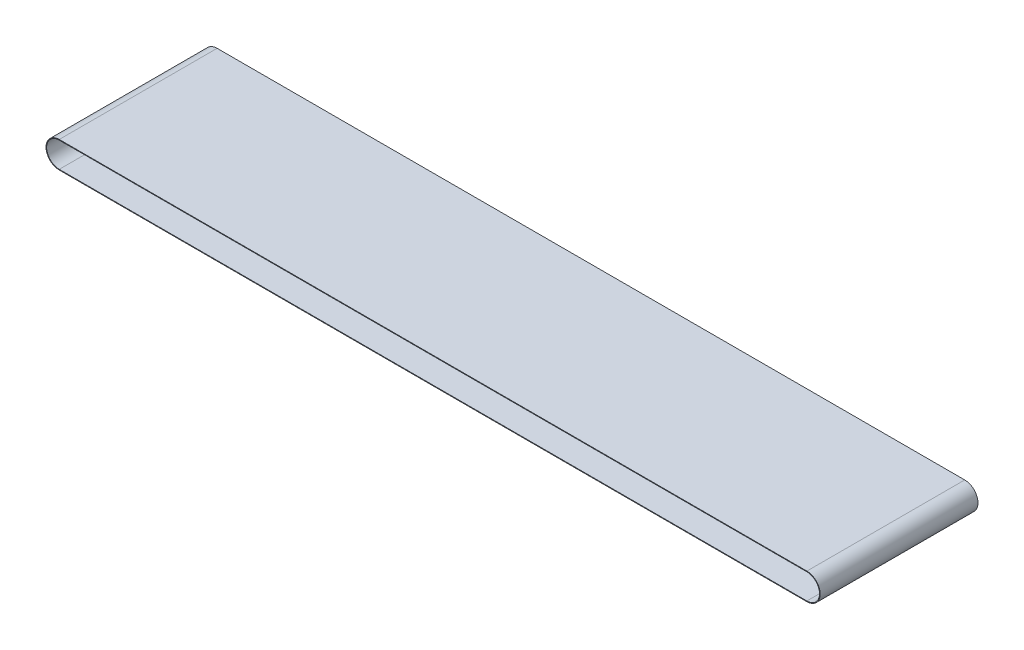
ISO-10303-21;
HEADER;
FILE_DESCRIPTION(('STEP AP214'),'2;1');
FILE_NAME('part.step','',(''),(''),'','','');
FILE_SCHEMA(('AUTOMOTIVE_DESIGN { 1 0 10303 214 1 1 1 1 }'));
ENDSEC;
DATA;
#1=APPLICATION_CONTEXT('core data for automotive mechanical design processes');
#2=APPLICATION_PROTOCOL_DEFINITION('international standard','automotive_design',2000,#1);
#3=PRODUCT_CONTEXT('',#1,'mechanical');
#4=PRODUCT('Part','Part','',(#3));
#5=PRODUCT_RELATED_PRODUCT_CATEGORY('part','',(#4));
#6=PRODUCT_DEFINITION_FORMATION('','',#4);
#7=PRODUCT_DEFINITION_CONTEXT('part definition',#1,'design');
#8=PRODUCT_DEFINITION('design','',#6,#7);
#9=PRODUCT_DEFINITION_SHAPE('','',#8);
#10=(LENGTH_UNIT() NAMED_UNIT(*) SI_UNIT(.MILLI.,.METRE.));
#11=(NAMED_UNIT(*) PLANE_ANGLE_UNIT() SI_UNIT($,.RADIAN.));
#12=(NAMED_UNIT(*) SI_UNIT($,.STERADIAN.) SOLID_ANGLE_UNIT());
#13=UNCERTAINTY_MEASURE_WITH_UNIT(LENGTH_MEASURE(1.E-05),#10,'distance_accuracy_value','');
#14=(GEOMETRIC_REPRESENTATION_CONTEXT(3) GLOBAL_UNCERTAINTY_ASSIGNED_CONTEXT((#13)) GLOBAL_UNIT_ASSIGNED_CONTEXT((#10,
#11,#12)) REPRESENTATION_CONTEXT('',''));
#15=CARTESIAN_POINT('',(0.,0.,0.));
#16=DIRECTION('',(0.,0.,1.));
#17=DIRECTION('',(1.,0.,0.));
#18=AXIS2_PLACEMENT_3D('',#15,#16,#17);
#19=CARTESIAN_POINT('',(-1184.025,0.,250.));
#20=DIRECTION('',(0.,0.,1.));
#21=DIRECTION('',(1.,0.,0.));
#22=AXIS2_PLACEMENT_3D('',#19,#20,#21);
#23=PLANE('',#22);
#24=CARTESIAN_POINT('',(-1184.025,0.,250.));
#25=DIRECTION('',(0.,0.,1.));
#26=DIRECTION('',(1.,0.,0.));
#27=AXIS2_PLACEMENT_3D('',#24,#25,#26);
#28=CIRCLE('',#27,42.);
#29=CARTESIAN_POINT('',(-1184.025,42.,250.));
#30=VERTEX_POINT('',#29);
#31=CARTESIAN_POINT('',(-1184.025,-42.,250.));
#32=VERTEX_POINT('',#31);
#33=EDGE_CURVE('E131',#30,#32,#28,.T.);
#34=ORIENTED_EDGE('',*,*,#33,.T.);
#35=DIRECTION('',(1.,0.,0.));
#36=VECTOR('',#35,1.);
#37=CARTESIAN_POINT('',(-1184.025,-42.,250.));
#38=LINE('',#37,#36);
#39=CARTESIAN_POINT('',(1184.025,-42.,250.));
#40=VERTEX_POINT('',#39);
#41=EDGE_CURVE('E134',#32,#40,#38,.T.);
#42=ORIENTED_EDGE('',*,*,#41,.T.);
#43=CARTESIAN_POINT('',(1184.025,0.,250.));
#44=DIRECTION('',(0.,0.,1.));
#45=DIRECTION('',(-1.,0.,0.));
#46=AXIS2_PLACEMENT_3D('',#43,#44,#45);
#47=CIRCLE('',#46,42.);
#48=CARTESIAN_POINT('',(1184.025,42.,250.));
#49=VERTEX_POINT('',#48);
#50=EDGE_CURVE('E137',#40,#49,#47,.T.);
#51=ORIENTED_EDGE('',*,*,#50,.T.);
#52=DIRECTION('',(-1.,0.,0.));
#53=VECTOR('',#52,1.);
#54=CARTESIAN_POINT('',(-1184.025,42.,250.));
#55=LINE('',#54,#53);
#56=EDGE_CURVE('E139',#49,#30,#55,.T.);
#57=ORIENTED_EDGE('',*,*,#56,.T.);
#58=EDGE_LOOP('',(#34,#42,#51,#57));
#59=FACE_BOUND('',#58,.T.);
#60=DIRECTION('',(1.,0.,0.));
#61=VECTOR('',#60,1.);
#62=CARTESIAN_POINT('',(-1184.025,-40.,250.));
#63=LINE('',#62,#61);
#64=CARTESIAN_POINT('',(-1184.025,-40.,250.));
#65=VERTEX_POINT('',#64);
#66=CARTESIAN_POINT('',(1184.025,-40.,250.));
#67=VERTEX_POINT('',#66);
#68=EDGE_CURVE('E103',#65,#67,#63,.T.);
#69=ORIENTED_EDGE('',*,*,#68,.F.);
#70=CARTESIAN_POINT('',(-1184.025,0.,250.));
#71=DIRECTION('',(0.,0.,1.));
#72=DIRECTION('',(1.,0.,0.));
#73=AXIS2_PLACEMENT_3D('',#70,#71,#72);
#74=CIRCLE('',#73,40.);
#75=CARTESIAN_POINT('',(-1184.025,40.,250.));
#76=VERTEX_POINT('',#75);
#77=EDGE_CURVE('E95',#76,#65,#74,.T.);
#78=ORIENTED_EDGE('',*,*,#77,.F.);
#79=DIRECTION('',(-1.,0.,0.));
#80=VECTOR('',#79,1.);
#81=CARTESIAN_POINT('',(-1184.025,40.,250.));
#82=LINE('',#81,#80);
#83=CARTESIAN_POINT('',(1184.025,40.0000000000003,250.));
#84=VERTEX_POINT('',#83);
#85=EDGE_CURVE('E117',#84,#76,#82,.T.);
#86=ORIENTED_EDGE('',*,*,#85,.F.);
#87=CARTESIAN_POINT('',(1184.025,0.,250.));
#88=DIRECTION('',(0.,0.,1.));
#89=DIRECTION('',(-1.,0.,0.));
#90=AXIS2_PLACEMENT_3D('',#87,#88,#89);
#91=CIRCLE('',#90,40.);
#92=EDGE_CURVE('E115',#67,#84,#91,.T.);
#93=ORIENTED_EDGE('',*,*,#92,.F.);
#94=EDGE_LOOP('',(#69,#78,#86,#93));
#95=FACE_BOUND('',#94,.T.);
#96=ADVANCED_FACE('F30',(#59,#95),#23,.T.);
#97=CARTESIAN_POINT('',(-1184.025,0.,-250.));
#98=DIRECTION('',(0.,0.,1.));
#99=DIRECTION('',(1.,0.,0.));
#100=AXIS2_PLACEMENT_3D('',#97,#98,#99);
#101=PLANE('',#100);
#102=CARTESIAN_POINT('',(-1184.025,0.,-250.));
#103=DIRECTION('',(0.,0.,1.));
#104=DIRECTION('',(1.,0.,0.));
#105=AXIS2_PLACEMENT_3D('',#102,#103,#104);
#106=CIRCLE('',#105,42.);
#107=CARTESIAN_POINT('',(-1184.025,42.,-250.));
#108=VERTEX_POINT('',#107);
#109=CARTESIAN_POINT('',(-1184.025,-42.,-250.));
#110=VERTEX_POINT('',#109);
#111=EDGE_CURVE('E111',#108,#110,#106,.T.);
#112=ORIENTED_EDGE('',*,*,#111,.F.);
#113=DIRECTION('',(-1.,0.,0.));
#114=VECTOR('',#113,1.);
#115=CARTESIAN_POINT('',(-1184.025,42.,-250.));
#116=LINE('',#115,#114);
#117=CARTESIAN_POINT('',(1184.025,42.,-250.));
#118=VERTEX_POINT('',#117);
#119=EDGE_CURVE('E135',#118,#108,#116,.T.);
#120=ORIENTED_EDGE('',*,*,#119,.F.);
#121=CARTESIAN_POINT('',(1184.025,0.,-250.));
#122=DIRECTION('',(0.,0.,1.));
#123=DIRECTION('',(-1.,0.,0.));
#124=AXIS2_PLACEMENT_3D('',#121,#122,#123);
#125=CIRCLE('',#124,42.);
#126=CARTESIAN_POINT('',(1184.025,-42.,-250.));
#127=VERTEX_POINT('',#126);
#128=EDGE_CURVE('E146',#127,#118,#125,.T.);
#129=ORIENTED_EDGE('',*,*,#128,.F.);
#130=DIRECTION('',(1.,0.,0.));
#131=VECTOR('',#130,1.);
#132=CARTESIAN_POINT('',(-1184.025,-42.,-250.));
#133=LINE('',#132,#131);
#134=EDGE_CURVE('E144',#110,#127,#133,.T.);
#135=ORIENTED_EDGE('',*,*,#134,.F.);
#136=EDGE_LOOP('',(#112,#120,#129,#135));
#137=FACE_BOUND('',#136,.T.);
#138=CARTESIAN_POINT('',(-1184.025,0.,-250.));
#139=DIRECTION('',(0.,0.,1.));
#140=DIRECTION('',(1.,0.,0.));
#141=AXIS2_PLACEMENT_3D('',#138,#139,#140);
#142=CIRCLE('',#141,40.);
#143=CARTESIAN_POINT('',(-1184.025,40.,-250.));
#144=VERTEX_POINT('',#143);
#145=CARTESIAN_POINT('',(-1184.025,-40.,-250.));
#146=VERTEX_POINT('',#145);
#147=EDGE_CURVE('E53',#144,#146,#142,.T.);
#148=ORIENTED_EDGE('',*,*,#147,.T.);
#149=DIRECTION('',(1.,0.,0.));
#150=VECTOR('',#149,1.);
#151=CARTESIAN_POINT('',(-1184.025,-40.,-250.));
#152=LINE('',#151,#150);
#153=CARTESIAN_POINT('',(1184.025,-40.,-250.));
#154=VERTEX_POINT('',#153);
#155=EDGE_CURVE('E110',#146,#154,#152,.T.);
#156=ORIENTED_EDGE('',*,*,#155,.T.);
#157=CARTESIAN_POINT('',(1184.025,0.,-250.));
#158=DIRECTION('',(0.,0.,1.));
#159=DIRECTION('',(-1.,0.,0.));
#160=AXIS2_PLACEMENT_3D('',#157,#158,#159);
#161=CIRCLE('',#160,40.);
#162=CARTESIAN_POINT('',(1184.025,40.0000000000003,-250.));
#163=VERTEX_POINT('',#162);
#164=EDGE_CURVE('E123',#154,#163,#161,.T.);
#165=ORIENTED_EDGE('',*,*,#164,.T.);
#166=DIRECTION('',(-1.,0.,0.));
#167=VECTOR('',#166,1.);
#168=CARTESIAN_POINT('',(-1184.025,40.,-250.));
#169=LINE('',#168,#167);
#170=EDGE_CURVE('E104',#163,#144,#169,.T.);
#171=ORIENTED_EDGE('',*,*,#170,.T.);
#172=EDGE_LOOP('',(#148,#156,#165,#171));
#173=FACE_BOUND('',#172,.T.);
#174=ADVANCED_FACE('F164',(#137,#173),#101,.F.);
#175=CARTESIAN_POINT('',(-1184.025,0.,250.));
#176=DIRECTION('',(0.,0.,-1.));
#177=DIRECTION('',(-1.,0.,0.));
#178=AXIS2_PLACEMENT_3D('',#175,#176,#177);
#179=CYLINDRICAL_SURFACE('',#178,42.);
#180=ORIENTED_EDGE('',*,*,#111,.T.);
#181=DIRECTION('',(0.,0.,-1.));
#182=VECTOR('',#181,1.);
#183=CARTESIAN_POINT('',(-1184.025,-42.,250.));
#184=LINE('',#183,#182);
#185=EDGE_CURVE('E11',#32,#110,#184,.T.);
#186=ORIENTED_EDGE('',*,*,#185,.F.);
#187=ORIENTED_EDGE('',*,*,#33,.F.);
#188=DIRECTION('',(0.,0.,-1.));
#189=VECTOR('',#188,1.);
#190=CARTESIAN_POINT('',(-1184.025,42.,250.));
#191=LINE('',#190,#189);
#192=EDGE_CURVE('E141',#30,#108,#191,.T.);
#193=ORIENTED_EDGE('',*,*,#192,.T.);
#194=EDGE_LOOP('',(#180,#186,#187,#193));
#195=FACE_BOUND('',#194,.T.);
#196=ADVANCED_FACE('F32',(#195),#179,.T.);
#197=CARTESIAN_POINT('',(-1184.025,-42.,250.));
#198=DIRECTION('',(0.,1.,0.));
#199=DIRECTION('',(0.,0.,1.));
#200=AXIS2_PLACEMENT_3D('',#197,#198,#199);
#201=PLANE('',#200);
#202=ORIENTED_EDGE('',*,*,#134,.T.);
#203=DIRECTION('',(0.,0.,-1.));
#204=VECTOR('',#203,1.);
#205=CARTESIAN_POINT('',(1184.025,-42.,250.));
#206=LINE('',#205,#204);
#207=EDGE_CURVE('E38',#40,#127,#206,.T.);
#208=ORIENTED_EDGE('',*,*,#207,.F.);
#209=ORIENTED_EDGE('',*,*,#41,.F.);
#210=ORIENTED_EDGE('',*,*,#185,.T.);
#211=EDGE_LOOP('',(#202,#208,#209,#210));
#212=FACE_BOUND('',#211,.T.);
#213=ADVANCED_FACE('F174',(#212),#201,.F.);
#214=CARTESIAN_POINT('',(1184.025,0.,250.));
#215=DIRECTION('',(0.,0.,-1.));
#216=DIRECTION('',(-1.,0.,0.));
#217=AXIS2_PLACEMENT_3D('',#214,#215,#216);
#218=CYLINDRICAL_SURFACE('',#217,42.);
#219=ORIENTED_EDGE('',*,*,#128,.T.);
#220=DIRECTION('',(0.,0.,-1.));
#221=VECTOR('',#220,1.);
#222=CARTESIAN_POINT('',(1184.025,42.,250.));
#223=LINE('',#222,#221);
#224=EDGE_CURVE('E151',#49,#118,#223,.T.);
#225=ORIENTED_EDGE('',*,*,#224,.F.);
#226=ORIENTED_EDGE('',*,*,#50,.F.);
#227=ORIENTED_EDGE('',*,*,#207,.T.);
#228=EDGE_LOOP('',(#219,#225,#226,#227));
#229=FACE_BOUND('',#228,.T.);
#230=ADVANCED_FACE('F158',(#229),#218,.T.);
#231=CARTESIAN_POINT('',(-1184.025,42.,250.));
#232=DIRECTION('',(0.,-1.,0.));
#233=DIRECTION('',(0.,0.,-1.));
#234=AXIS2_PLACEMENT_3D('',#231,#232,#233);
#235=PLANE('',#234);
#236=ORIENTED_EDGE('',*,*,#119,.T.);
#237=ORIENTED_EDGE('',*,*,#192,.F.);
#238=ORIENTED_EDGE('',*,*,#56,.F.);
#239=ORIENTED_EDGE('',*,*,#224,.T.);
#240=EDGE_LOOP('',(#236,#237,#238,#239));
#241=FACE_BOUND('',#240,.T.);
#242=ADVANCED_FACE('F168',(#241),#235,.F.);
#243=CARTESIAN_POINT('',(-1184.025,0.,250.));
#244=DIRECTION('',(0.,0.,-1.));
#245=DIRECTION('',(-1.,0.,0.));
#246=AXIS2_PLACEMENT_3D('',#243,#244,#245);
#247=CYLINDRICAL_SURFACE('',#246,40.);
#248=ORIENTED_EDGE('',*,*,#147,.F.);
#249=DIRECTION('',(0.,0.,-1.));
#250=VECTOR('',#249,1.);
#251=CARTESIAN_POINT('',(-1184.025,40.,250.));
#252=LINE('',#251,#250);
#253=EDGE_CURVE('E99',#76,#144,#252,.T.);
#254=ORIENTED_EDGE('',*,*,#253,.F.);
#255=ORIENTED_EDGE('',*,*,#77,.T.);
#256=DIRECTION('',(0.,0.,-1.));
#257=VECTOR('',#256,1.);
#258=CARTESIAN_POINT('',(-1184.025,-40.,250.));
#259=LINE('',#258,#257);
#260=EDGE_CURVE('E98',#65,#146,#259,.T.);
#261=ORIENTED_EDGE('',*,*,#260,.T.);
#262=EDGE_LOOP('',(#248,#254,#255,#261));
#263=FACE_BOUND('',#262,.T.);
#264=ADVANCED_FACE('F97',(#263),#247,.F.);
#265=CARTESIAN_POINT('',(-1184.025,-40.,250.));
#266=DIRECTION('',(0.,1.,0.));
#267=DIRECTION('',(-1.,0.,0.));
#268=AXIS2_PLACEMENT_3D('',#265,#266,#267);
#269=PLANE('',#268);
#270=ORIENTED_EDGE('',*,*,#155,.F.);
#271=ORIENTED_EDGE('',*,*,#260,.F.);
#272=ORIENTED_EDGE('',*,*,#68,.T.);
#273=DIRECTION('',(0.,0.,-1.));
#274=VECTOR('',#273,1.);
#275=CARTESIAN_POINT('',(1184.025,-40.,250.));
#276=LINE('',#275,#274);
#277=EDGE_CURVE('E112',#67,#154,#276,.T.);
#278=ORIENTED_EDGE('',*,*,#277,.T.);
#279=EDGE_LOOP('',(#270,#271,#272,#278));
#280=FACE_BOUND('',#279,.T.);
#281=ADVANCED_FACE('F107',(#280),#269,.T.);
#282=CARTESIAN_POINT('',(1184.025,0.,250.));
#283=DIRECTION('',(0.,0.,-1.));
#284=DIRECTION('',(-1.,0.,0.));
#285=AXIS2_PLACEMENT_3D('',#282,#283,#284);
#286=CYLINDRICAL_SURFACE('',#285,40.);
#287=ORIENTED_EDGE('',*,*,#164,.F.);
#288=ORIENTED_EDGE('',*,*,#277,.F.);
#289=ORIENTED_EDGE('',*,*,#92,.T.);
#290=DIRECTION('',(0.,0.,-1.));
#291=VECTOR('',#290,1.);
#292=CARTESIAN_POINT('',(1184.025,40.0000000000003,250.));
#293=LINE('',#292,#291);
#294=EDGE_CURVE('E45',#84,#163,#293,.T.);
#295=ORIENTED_EDGE('',*,*,#294,.T.);
#296=EDGE_LOOP('',(#287,#288,#289,#295));
#297=FACE_BOUND('',#296,.T.);
#298=ADVANCED_FACE('F197',(#297),#286,.F.);
#299=CARTESIAN_POINT('',(-1184.025,40.,250.));
#300=DIRECTION('',(0.,-1.,0.));
#301=DIRECTION('',(1.,0.,0.));
#302=AXIS2_PLACEMENT_3D('',#299,#300,#301);
#303=PLANE('',#302);
#304=ORIENTED_EDGE('',*,*,#170,.F.);
#305=ORIENTED_EDGE('',*,*,#294,.F.);
#306=ORIENTED_EDGE('',*,*,#85,.T.);
#307=ORIENTED_EDGE('',*,*,#253,.T.);
#308=EDGE_LOOP('',(#304,#305,#306,#307));
#309=FACE_BOUND('',#308,.T.);
#310=ADVANCED_FACE('F201',(#309),#303,.T.);
#311=CLOSED_SHELL('',(#96,#174,#196,#213,#230,#242,#264,#281,#298,#310));
#312=MANIFOLD_SOLID_BREP('B2',#311);
#313=ADVANCED_BREP_SHAPE_REPRESENTATION('',(#18,#312),#14);
#314=SHAPE_DEFINITION_REPRESENTATION(#9,#313);
ENDSEC;
END-ISO-10303-21;
